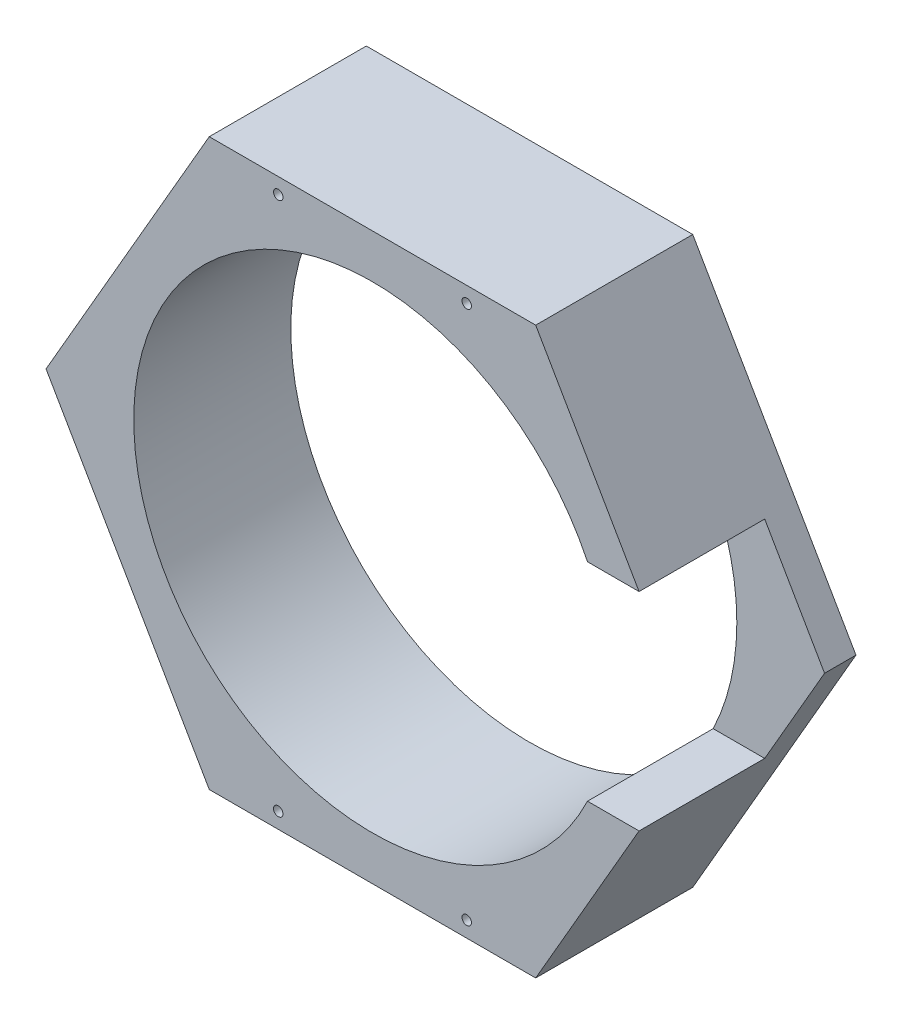
ISO-10303-21;
HEADER;
FILE_DESCRIPTION(('STEP AP214'),'2;1');
FILE_NAME('part.step','',(''),(''),'','','');
FILE_SCHEMA(('AUTOMOTIVE_DESIGN { 1 0 10303 214 1 1 1 1 }'));
ENDSEC;
DATA;
#1=APPLICATION_CONTEXT('core data for automotive mechanical design processes');
#2=APPLICATION_PROTOCOL_DEFINITION('international standard','automotive_design',2000,#1);
#3=PRODUCT_CONTEXT('',#1,'mechanical');
#4=PRODUCT('Part','Part','',(#3));
#5=PRODUCT_RELATED_PRODUCT_CATEGORY('part','',(#4));
#6=PRODUCT_DEFINITION_FORMATION('','',#4);
#7=PRODUCT_DEFINITION_CONTEXT('part definition',#1,'design');
#8=PRODUCT_DEFINITION('design','',#6,#7);
#9=PRODUCT_DEFINITION_SHAPE('','',#8);
#10=(LENGTH_UNIT() NAMED_UNIT(*) SI_UNIT(.MILLI.,.METRE.));
#11=(NAMED_UNIT(*) PLANE_ANGLE_UNIT() SI_UNIT($,.RADIAN.));
#12=(NAMED_UNIT(*) SI_UNIT($,.STERADIAN.) SOLID_ANGLE_UNIT());
#13=UNCERTAINTY_MEASURE_WITH_UNIT(LENGTH_MEASURE(1.E-05),#10,'distance_accuracy_value','');
#14=(GEOMETRIC_REPRESENTATION_CONTEXT(3) GLOBAL_UNCERTAINTY_ASSIGNED_CONTEXT((#13)) GLOBAL_UNIT_ASSIGNED_CONTEXT((#10,
#11,#12)) REPRESENTATION_CONTEXT('',''));
#15=CARTESIAN_POINT('',(0.,0.,0.));
#16=DIRECTION('',(0.,0.,1.));
#17=DIRECTION('',(1.,0.,0.));
#18=AXIS2_PLACEMENT_3D('',#15,#16,#17);
#19=CARTESIAN_POINT('',(0.,0.,50.));
#20=DIRECTION('',(0.,0.,1.));
#21=DIRECTION('',(1.,0.,0.));
#22=AXIS2_PLACEMENT_3D('',#19,#20,#21);
#23=PLANE('',#22);
#24=CARTESIAN_POINT('',(30.,85.,50.));
#25=DIRECTION('',(0.,0.,1.));
#26=DIRECTION('',(1.,0.,0.));
#27=AXIS2_PLACEMENT_3D('',#24,#25,#26);
#28=CIRCLE('',#27,1.5);
#29=CARTESIAN_POINT('',(31.5,85.,50.));
#30=VERTEX_POINT('',#29);
#31=EDGE_CURVE('E207',#30,#30,#28,.T.);
#32=ORIENTED_EDGE('',*,*,#31,.F.);
#33=EDGE_LOOP('',(#32));
#34=FACE_BOUND('',#33,.T.);
#35=CARTESIAN_POINT('',(30.,-85.,50.));
#36=DIRECTION('',(0.,0.,1.));
#37=DIRECTION('',(1.,0.,0.));
#38=AXIS2_PLACEMENT_3D('',#35,#36,#37);
#39=CIRCLE('',#38,1.5);
#40=CARTESIAN_POINT('',(31.5,-85.,50.));
#41=VERTEX_POINT('',#40);
#42=EDGE_CURVE('E191',#41,#41,#39,.T.);
#43=ORIENTED_EDGE('',*,*,#42,.F.);
#44=EDGE_LOOP('',(#43));
#45=FACE_BOUND('',#44,.T.);
#46=CARTESIAN_POINT('',(-30.,-85.,50.));
#47=DIRECTION('',(0.,0.,1.));
#48=DIRECTION('',(1.,0.,0.));
#49=AXIS2_PLACEMENT_3D('',#46,#47,#48);
#50=CIRCLE('',#49,1.5);
#51=CARTESIAN_POINT('',(-28.5,-85.,50.));
#52=VERTEX_POINT('',#51);
#53=EDGE_CURVE('E199',#52,#52,#50,.T.);
#54=ORIENTED_EDGE('',*,*,#53,.F.);
#55=EDGE_LOOP('',(#54));
#56=FACE_BOUND('',#55,.T.);
#57=CARTESIAN_POINT('',(-30.,85.,50.));
#58=DIRECTION('',(0.,0.,1.));
#59=DIRECTION('',(1.,0.,0.));
#60=AXIS2_PLACEMENT_3D('',#57,#58,#59);
#61=CIRCLE('',#60,1.5);
#62=CARTESIAN_POINT('',(-28.5,85.,50.));
#63=VERTEX_POINT('',#62);
#64=EDGE_CURVE('E215',#63,#63,#61,.T.);
#65=ORIENTED_EDGE('',*,*,#64,.F.);
#66=EDGE_LOOP('',(#65));
#67=FACE_BOUND('',#66,.T.);
#68=CARTESIAN_POINT('',(0.,0.,50.));
#69=DIRECTION('',(0.,0.,1.));
#70=DIRECTION('',(1.,0.,0.));
#71=AXIS2_PLACEMENT_3D('',#68,#69,#70);
#72=CIRCLE('',#71,76.);
#73=CARTESIAN_POINT('',(68.461668107051,33.,50.));
#74=VERTEX_POINT('',#73);
#75=CARTESIAN_POINT('',(68.461668107051,-33.,50.));
#76=VERTEX_POINT('',#75);
#77=EDGE_CURVE('E142',#74,#76,#72,.T.);
#78=ORIENTED_EDGE('',*,*,#77,.F.);
#79=DIRECTION('',(1.,0.,0.));
#80=VECTOR('',#79,1.);
#81=CARTESIAN_POINT('',(0.,33.,50.));
#82=LINE('',#81,#80);
#83=CARTESIAN_POINT('',(84.870489570875,33.,50.));
#84=VERTEX_POINT('',#83);
#85=EDGE_CURVE('E245',#74,#84,#82,.T.);
#86=ORIENTED_EDGE('',*,*,#85,.T.);
#87=DIRECTION('',(-0.500000000000001,0.866025403784438,0.));
#88=VECTOR('',#87,1.);
#89=CARTESIAN_POINT('',(103.923048454133,0.,50.));
#90=LINE('',#89,#88);
#91=CARTESIAN_POINT('',(51.9615242270661,90.0000000000002,50.));
#92=VERTEX_POINT('',#91);
#93=EDGE_CURVE('E97',#84,#92,#90,.T.);
#94=ORIENTED_EDGE('',*,*,#93,.T.);
#95=DIRECTION('',(-1.,0.,0.));
#96=VECTOR('',#95,1.);
#97=CARTESIAN_POINT('',(51.9615242270661,90.0000000000002,50.));
#98=LINE('',#97,#96);
#99=CARTESIAN_POINT('',(-51.9615242270668,89.9999999999998,50.));
#100=VERTEX_POINT('',#99);
#101=EDGE_CURVE('E112',#92,#100,#98,.T.);
#102=ORIENTED_EDGE('',*,*,#101,.T.);
#103=DIRECTION('',(-0.499999999999995,-0.866025403784441,0.));
#104=VECTOR('',#103,1.);
#105=CARTESIAN_POINT('',(-51.9615242270668,89.9999999999998,50.));
#106=LINE('',#105,#104);
#107=CARTESIAN_POINT('',(-103.923048454133,-7.2569076870659E-13,50.));
#108=VERTEX_POINT('',#107);
#109=EDGE_CURVE('E105',#100,#108,#106,.T.);
#110=ORIENTED_EDGE('',*,*,#109,.T.);
#111=DIRECTION('',(0.500000000000007,-0.866025403784435,0.));
#112=VECTOR('',#111,1.);
#113=CARTESIAN_POINT('',(-103.923048454133,-7.2569076870659E-13,50.));
#114=LINE('',#113,#112);
#115=CARTESIAN_POINT('',(-51.9615242270655,-90.0000000000005,50.));
#116=VERTEX_POINT('',#115);
#117=EDGE_CURVE('E109',#108,#116,#114,.T.);
#118=ORIENTED_EDGE('',*,*,#117,.T.);
#119=DIRECTION('',(1.,0.,0.));
#120=VECTOR('',#119,1.);
#121=CARTESIAN_POINT('',(-51.9615242270655,-90.0000000000005,50.));
#122=LINE('',#121,#120);
#123=CARTESIAN_POINT('',(51.9615242270674,-89.9999999999995,50.));
#124=VERTEX_POINT('',#123);
#125=EDGE_CURVE('E63',#116,#124,#122,.T.);
#126=ORIENTED_EDGE('',*,*,#125,.T.);
#127=DIRECTION('',(0.499999999999995,0.866025403784441,0.));
#128=VECTOR('',#127,1.);
#129=CARTESIAN_POINT('',(51.9615242270674,-89.9999999999995,50.));
#130=LINE('',#129,#128);
#131=CARTESIAN_POINT('',(84.8704895708753,-33.,50.));
#132=VERTEX_POINT('',#131);
#133=EDGE_CURVE('E155',#124,#132,#130,.T.);
#134=ORIENTED_EDGE('',*,*,#133,.T.);
#135=DIRECTION('',(1.,0.,0.));
#136=VECTOR('',#135,1.);
#137=CARTESIAN_POINT('',(0.,-33.,50.));
#138=LINE('',#137,#136);
#139=EDGE_CURVE('E241',#76,#132,#138,.T.);
#140=ORIENTED_EDGE('',*,*,#139,.F.);
#141=EDGE_LOOP('',(#78,#86,#94,#102,#110,#118,#126,#134,#140));
#142=FACE_BOUND('',#141,.T.);
#143=ADVANCED_FACE('F38',(#34,#45,#56,#67,#142),#23,.T.);
#144=CARTESIAN_POINT('',(103.923048454133,0.,50.));
#145=DIRECTION('',(-0.866025403784438,-0.500000000000001,0.));
#146=DIRECTION('',(0.500000000000001,-0.866025403784438,0.));
#147=AXIS2_PLACEMENT_3D('',#144,#145,#146);
#148=PLANE('',#147);
#149=DIRECTION('',(0.,0.,1.));
#150=VECTOR('',#149,1.);
#151=CARTESIAN_POINT('',(84.870489570875,33.,10.));
#152=LINE('',#151,#150);
#153=CARTESIAN_POINT('',(84.870489570875,33.,10.));
#154=VERTEX_POINT('',#153);
#155=EDGE_CURVE('E223',#154,#84,#152,.T.);
#156=ORIENTED_EDGE('',*,*,#155,.F.);
#157=DIRECTION('',(-0.500000000000001,0.866025403784438,0.));
#158=VECTOR('',#157,1.);
#159=CARTESIAN_POINT('',(77.9422863405994,45.0000000000001,10.));
#160=LINE('',#159,#158);
#161=CARTESIAN_POINT('',(103.923048454133,0.,10.));
#162=VERTEX_POINT('',#161);
#163=EDGE_CURVE('E232',#162,#154,#160,.T.);
#164=ORIENTED_EDGE('',*,*,#163,.F.);
#165=DIRECTION('',(0.,0.,-1.));
#166=VECTOR('',#165,1.);
#167=CARTESIAN_POINT('',(103.923048454133,0.,50.));
#168=LINE('',#167,#166);
#169=CARTESIAN_POINT('',(103.923048454133,0.,0.));
#170=VERTEX_POINT('',#169);
#171=EDGE_CURVE('E11',#162,#170,#168,.T.);
#172=ORIENTED_EDGE('',*,*,#171,.T.);
#173=DIRECTION('',(-0.500000000000001,0.866025403784438,0.));
#174=VECTOR('',#173,1.);
#175=CARTESIAN_POINT('',(103.923048454133,0.,0.));
#176=LINE('',#175,#174);
#177=CARTESIAN_POINT('',(51.9615242270661,90.0000000000002,0.));
#178=VERTEX_POINT('',#177);
#179=EDGE_CURVE('E141',#170,#178,#176,.T.);
#180=ORIENTED_EDGE('',*,*,#179,.T.);
#181=DIRECTION('',(0.,0.,-1.));
#182=VECTOR('',#181,1.);
#183=CARTESIAN_POINT('',(51.9615242270661,90.0000000000002,50.));
#184=LINE('',#183,#182);
#185=EDGE_CURVE('E47',#92,#178,#184,.T.);
#186=ORIENTED_EDGE('',*,*,#185,.F.);
#187=ORIENTED_EDGE('',*,*,#93,.F.);
#188=EDGE_LOOP('',(#156,#164,#172,#180,#186,#187));
#189=FACE_BOUND('',#188,.T.);
#190=ADVANCED_FACE('F272',(#189),#148,.F.);
#191=CARTESIAN_POINT('',(0.,0.,50.));
#192=DIRECTION('',(0.,0.,-1.));
#193=DIRECTION('',(-1.,0.,0.));
#194=AXIS2_PLACEMENT_3D('',#191,#192,#193);
#195=CYLINDRICAL_SURFACE('',#194,76.);
#196=CARTESIAN_POINT('',(0.,0.,0.));
#197=DIRECTION('',(0.,0.,1.));
#198=DIRECTION('',(1.,0.,0.));
#199=AXIS2_PLACEMENT_3D('',#196,#197,#198);
#200=CIRCLE('',#199,76.);
#201=CARTESIAN_POINT('',(76.,0.,0.));
#202=VERTEX_POINT('',#201);
#203=EDGE_CURVE('E186',#202,#202,#200,.T.);
#204=ORIENTED_EDGE('',*,*,#203,.F.);
#205=EDGE_LOOP('',(#204));
#206=FACE_BOUND('',#205,.T.);
#207=CARTESIAN_POINT('',(0.,0.,10.));
#208=DIRECTION('',(0.,0.,1.));
#209=DIRECTION('',(1.,0.,0.));
#210=AXIS2_PLACEMENT_3D('',#207,#208,#209);
#211=CIRCLE('',#210,76.);
#212=CARTESIAN_POINT('',(68.461668107051,33.,10.));
#213=VERTEX_POINT('',#212);
#214=CARTESIAN_POINT('',(68.461668107051,-33.,10.));
#215=VERTEX_POINT('',#214);
#216=EDGE_CURVE('E258',#213,#215,#211,.F.);
#217=ORIENTED_EDGE('',*,*,#216,.F.);
#218=DIRECTION('',(0.,0.,1.));
#219=VECTOR('',#218,1.);
#220=CARTESIAN_POINT('',(68.461668107051,33.,10.));
#221=LINE('',#220,#219);
#222=EDGE_CURVE('E227',#213,#74,#221,.T.);
#223=ORIENTED_EDGE('',*,*,#222,.T.);
#224=ORIENTED_EDGE('',*,*,#77,.T.);
#225=DIRECTION('',(0.,0.,1.));
#226=VECTOR('',#225,1.);
#227=CARTESIAN_POINT('',(68.461668107051,-33.,10.));
#228=LINE('',#227,#226);
#229=EDGE_CURVE('E231',#215,#76,#228,.T.);
#230=ORIENTED_EDGE('',*,*,#229,.F.);
#231=EDGE_LOOP('',(#217,#223,#224,#230));
#232=FACE_BOUND('',#231,.T.);
#233=ADVANCED_FACE('F287',(#206,#232),#195,.F.);
#234=CARTESIAN_POINT('',(0.,0.,0.));
#235=DIRECTION('',(0.,0.,1.));
#236=DIRECTION('',(1.,0.,0.));
#237=AXIS2_PLACEMENT_3D('',#234,#235,#236);
#238=PLANE('',#237);
#239=DIRECTION('',(0.499999999999995,0.866025403784441,0.));
#240=VECTOR('',#239,1.);
#241=CARTESIAN_POINT('',(51.9615242270674,-89.9999999999995,0.));
#242=LINE('',#241,#240);
#243=CARTESIAN_POINT('',(51.9615242270674,-89.9999999999995,0.));
#244=VERTEX_POINT('',#243);
#245=EDGE_CURVE('E137',#244,#170,#242,.T.);
#246=ORIENTED_EDGE('',*,*,#245,.F.);
#247=DIRECTION('',(1.,0.,0.));
#248=VECTOR('',#247,1.);
#249=CARTESIAN_POINT('',(-51.9615242270655,-90.0000000000005,0.));
#250=LINE('',#249,#248);
#251=CARTESIAN_POINT('',(-51.9615242270655,-90.0000000000005,0.));
#252=VERTEX_POINT('',#251);
#253=EDGE_CURVE('E89',#252,#244,#250,.T.);
#254=ORIENTED_EDGE('',*,*,#253,.F.);
#255=DIRECTION('',(0.500000000000007,-0.866025403784435,0.));
#256=VECTOR('',#255,1.);
#257=CARTESIAN_POINT('',(-103.923048454133,-7.2569076870659E-13,0.));
#258=LINE('',#257,#256);
#259=CARTESIAN_POINT('',(-103.923048454133,-7.2569076870659E-13,0.));
#260=VERTEX_POINT('',#259);
#261=EDGE_CURVE('E150',#260,#252,#258,.T.);
#262=ORIENTED_EDGE('',*,*,#261,.F.);
#263=DIRECTION('',(-0.499999999999995,-0.866025403784441,0.));
#264=VECTOR('',#263,1.);
#265=CARTESIAN_POINT('',(-51.9615242270668,89.9999999999998,0.));
#266=LINE('',#265,#264);
#267=CARTESIAN_POINT('',(-51.9615242270668,89.9999999999998,0.));
#268=VERTEX_POINT('',#267);
#269=EDGE_CURVE('E122',#268,#260,#266,.T.);
#270=ORIENTED_EDGE('',*,*,#269,.F.);
#271=DIRECTION('',(-1.,0.,0.));
#272=VECTOR('',#271,1.);
#273=CARTESIAN_POINT('',(51.9615242270661,90.0000000000002,0.));
#274=LINE('',#273,#272);
#275=EDGE_CURVE('E145',#178,#268,#274,.T.);
#276=ORIENTED_EDGE('',*,*,#275,.F.);
#277=ORIENTED_EDGE('',*,*,#179,.F.);
#278=EDGE_LOOP('',(#246,#254,#262,#270,#276,#277));
#279=FACE_BOUND('',#278,.T.);
#280=ORIENTED_EDGE('',*,*,#203,.T.);
#281=EDGE_LOOP('',(#280));
#282=FACE_BOUND('',#281,.T.);
#283=CARTESIAN_POINT('',(30.,-85.,0.));
#284=DIRECTION('',(0.,0.,1.));
#285=DIRECTION('',(1.,0.,0.));
#286=AXIS2_PLACEMENT_3D('',#283,#284,#285);
#287=CIRCLE('',#286,1.5);
#288=CARTESIAN_POINT('',(31.5,-85.,0.));
#289=VERTEX_POINT('',#288);
#290=EDGE_CURVE('E195',#289,#289,#287,.T.);
#291=ORIENTED_EDGE('',*,*,#290,.T.);
#292=EDGE_LOOP('',(#291));
#293=FACE_BOUND('',#292,.T.);
#294=CARTESIAN_POINT('',(-30.,-85.,0.));
#295=DIRECTION('',(0.,0.,1.));
#296=DIRECTION('',(1.,0.,0.));
#297=AXIS2_PLACEMENT_3D('',#294,#295,#296);
#298=CIRCLE('',#297,1.5);
#299=CARTESIAN_POINT('',(-28.5,-85.,0.));
#300=VERTEX_POINT('',#299);
#301=EDGE_CURVE('E203',#300,#300,#298,.T.);
#302=ORIENTED_EDGE('',*,*,#301,.T.);
#303=EDGE_LOOP('',(#302));
#304=FACE_BOUND('',#303,.T.);
#305=CARTESIAN_POINT('',(30.,85.,0.));
#306=DIRECTION('',(0.,0.,1.));
#307=DIRECTION('',(1.,0.,0.));
#308=AXIS2_PLACEMENT_3D('',#305,#306,#307);
#309=CIRCLE('',#308,1.5);
#310=CARTESIAN_POINT('',(31.5,85.,0.));
#311=VERTEX_POINT('',#310);
#312=EDGE_CURVE('E211',#311,#311,#309,.T.);
#313=ORIENTED_EDGE('',*,*,#312,.T.);
#314=EDGE_LOOP('',(#313));
#315=FACE_BOUND('',#314,.T.);
#316=CARTESIAN_POINT('',(-30.,85.,0.));
#317=DIRECTION('',(0.,0.,1.));
#318=DIRECTION('',(1.,0.,0.));
#319=AXIS2_PLACEMENT_3D('',#316,#317,#318);
#320=CIRCLE('',#319,1.5);
#321=CARTESIAN_POINT('',(-28.5,85.,0.));
#322=VERTEX_POINT('',#321);
#323=EDGE_CURVE('E219',#322,#322,#320,.T.);
#324=ORIENTED_EDGE('',*,*,#323,.T.);
#325=EDGE_LOOP('',(#324));
#326=FACE_BOUND('',#325,.T.);
#327=ADVANCED_FACE('F170',(#279,#282,#293,#304,#315,#326),#238,.F.);
#328=CARTESIAN_POINT('',(51.9615242270674,-89.9999999999995,50.));
#329=DIRECTION('',(-0.866025403784442,0.499999999999995,0.));
#330=DIRECTION('',(-0.499999999999995,-0.866025403784442,0.));
#331=AXIS2_PLACEMENT_3D('',#328,#329,#330);
#332=PLANE('',#331);
#333=DIRECTION('',(0.499999999999995,0.866025403784442,0.));
#334=VECTOR('',#333,1.);
#335=CARTESIAN_POINT('',(77.9422863406,-44.9999999999997,10.));
#336=LINE('',#335,#334);
#337=CARTESIAN_POINT('',(84.8704895708753,-33.,10.));
#338=VERTEX_POINT('',#337);
#339=EDGE_CURVE('E250',#338,#162,#336,.T.);
#340=ORIENTED_EDGE('',*,*,#339,.F.);
#341=DIRECTION('',(0.,0.,1.));
#342=VECTOR('',#341,1.);
#343=CARTESIAN_POINT('',(84.8704895708753,-33.,10.));
#344=LINE('',#343,#342);
#345=EDGE_CURVE('E179',#338,#132,#344,.T.);
#346=ORIENTED_EDGE('',*,*,#345,.T.);
#347=ORIENTED_EDGE('',*,*,#133,.F.);
#348=DIRECTION('',(0.,0.,-1.));
#349=VECTOR('',#348,1.);
#350=CARTESIAN_POINT('',(51.9615242270674,-89.9999999999995,50.));
#351=LINE('',#350,#349);
#352=EDGE_CURVE('E133',#124,#244,#351,.T.);
#353=ORIENTED_EDGE('',*,*,#352,.T.);
#354=ORIENTED_EDGE('',*,*,#245,.T.);
#355=ORIENTED_EDGE('',*,*,#171,.F.);
#356=EDGE_LOOP('',(#340,#346,#347,#353,#354,#355));
#357=FACE_BOUND('',#356,.T.);
#358=ADVANCED_FACE('F40',(#357),#332,.F.);
#359=CARTESIAN_POINT('',(51.9615242270661,90.0000000000002,50.));
#360=DIRECTION('',(0.,-1.,0.));
#361=DIRECTION('',(1.,0.,0.));
#362=AXIS2_PLACEMENT_3D('',#359,#360,#361);
#363=PLANE('',#362);
#364=ORIENTED_EDGE('',*,*,#275,.T.);
#365=DIRECTION('',(0.,0.,-1.));
#366=VECTOR('',#365,1.);
#367=CARTESIAN_POINT('',(-51.9615242270668,89.9999999999998,50.));
#368=LINE('',#367,#366);
#369=EDGE_CURVE('E126',#100,#268,#368,.T.);
#370=ORIENTED_EDGE('',*,*,#369,.F.);
#371=ORIENTED_EDGE('',*,*,#101,.F.);
#372=ORIENTED_EDGE('',*,*,#185,.T.);
#373=EDGE_LOOP('',(#364,#370,#371,#372));
#374=FACE_BOUND('',#373,.T.);
#375=ADVANCED_FACE('F165',(#374),#363,.F.);
#376=CARTESIAN_POINT('',(-51.9615242270668,89.9999999999998,50.));
#377=DIRECTION('',(0.866025403784442,-0.499999999999995,0.));
#378=DIRECTION('',(0.499999999999995,0.866025403784442,0.));
#379=AXIS2_PLACEMENT_3D('',#376,#377,#378);
#380=PLANE('',#379);
#381=ORIENTED_EDGE('',*,*,#269,.T.);
#382=DIRECTION('',(0.,0.,-1.));
#383=VECTOR('',#382,1.);
#384=CARTESIAN_POINT('',(-103.923048454133,-7.2569076870659E-13,50.));
#385=LINE('',#384,#383);
#386=EDGE_CURVE('E119',#108,#260,#385,.T.);
#387=ORIENTED_EDGE('',*,*,#386,.F.);
#388=ORIENTED_EDGE('',*,*,#109,.F.);
#389=ORIENTED_EDGE('',*,*,#369,.T.);
#390=EDGE_LOOP('',(#381,#387,#388,#389));
#391=FACE_BOUND('',#390,.T.);
#392=ADVANCED_FACE('F120',(#391),#380,.F.);
#393=CARTESIAN_POINT('',(-103.923048454133,-7.2569076870659E-13,50.));
#394=DIRECTION('',(0.866025403784435,0.500000000000007,0.));
#395=DIRECTION('',(-0.500000000000007,0.866025403784435,0.));
#396=AXIS2_PLACEMENT_3D('',#393,#394,#395);
#397=PLANE('',#396);
#398=ORIENTED_EDGE('',*,*,#261,.T.);
#399=DIRECTION('',(0.,0.,-1.));
#400=VECTOR('',#399,1.);
#401=CARTESIAN_POINT('',(-51.9615242270655,-90.0000000000005,50.));
#402=LINE('',#401,#400);
#403=EDGE_CURVE('E127',#116,#252,#402,.T.);
#404=ORIENTED_EDGE('',*,*,#403,.F.);
#405=ORIENTED_EDGE('',*,*,#117,.F.);
#406=ORIENTED_EDGE('',*,*,#386,.T.);
#407=EDGE_LOOP('',(#398,#404,#405,#406));
#408=FACE_BOUND('',#407,.T.);
#409=ADVANCED_FACE('F129',(#408),#397,.F.);
#410=CARTESIAN_POINT('',(-51.9615242270655,-90.0000000000005,50.));
#411=DIRECTION('',(0.,1.,0.));
#412=DIRECTION('',(-1.,0.,0.));
#413=AXIS2_PLACEMENT_3D('',#410,#411,#412);
#414=PLANE('',#413);
#415=ORIENTED_EDGE('',*,*,#253,.T.);
#416=ORIENTED_EDGE('',*,*,#352,.F.);
#417=ORIENTED_EDGE('',*,*,#125,.F.);
#418=ORIENTED_EDGE('',*,*,#403,.T.);
#419=EDGE_LOOP('',(#415,#416,#417,#418));
#420=FACE_BOUND('',#419,.T.);
#421=ADVANCED_FACE('F172',(#420),#414,.F.);
#422=CARTESIAN_POINT('',(30.,-85.,50.));
#423=DIRECTION('',(0.,0.,-1.));
#424=DIRECTION('',(-1.,0.,0.));
#425=AXIS2_PLACEMENT_3D('',#422,#423,#424);
#426=CYLINDRICAL_SURFACE('',#425,1.5);
#427=ORIENTED_EDGE('',*,*,#42,.T.);
#428=EDGE_LOOP('',(#427));
#429=FACE_BOUND('',#428,.T.);
#430=ORIENTED_EDGE('',*,*,#290,.F.);
#431=EDGE_LOOP('',(#430));
#432=FACE_BOUND('',#431,.T.);
#433=ADVANCED_FACE('F310',(#429,#432),#426,.F.);
#434=CARTESIAN_POINT('',(-30.,-85.,50.));
#435=DIRECTION('',(0.,0.,-1.));
#436=DIRECTION('',(-1.,0.,0.));
#437=AXIS2_PLACEMENT_3D('',#434,#435,#436);
#438=CYLINDRICAL_SURFACE('',#437,1.5);
#439=ORIENTED_EDGE('',*,*,#53,.T.);
#440=EDGE_LOOP('',(#439));
#441=FACE_BOUND('',#440,.T.);
#442=ORIENTED_EDGE('',*,*,#301,.F.);
#443=EDGE_LOOP('',(#442));
#444=FACE_BOUND('',#443,.T.);
#445=ADVANCED_FACE('F358',(#441,#444),#438,.F.);
#446=CARTESIAN_POINT('',(30.,85.,50.));
#447=DIRECTION('',(0.,0.,-1.));
#448=DIRECTION('',(-1.,0.,0.));
#449=AXIS2_PLACEMENT_3D('',#446,#447,#448);
#450=CYLINDRICAL_SURFACE('',#449,1.5);
#451=ORIENTED_EDGE('',*,*,#31,.T.);
#452=EDGE_LOOP('',(#451));
#453=FACE_BOUND('',#452,.T.);
#454=ORIENTED_EDGE('',*,*,#312,.F.);
#455=EDGE_LOOP('',(#454));
#456=FACE_BOUND('',#455,.T.);
#457=ADVANCED_FACE('F354',(#453,#456),#450,.F.);
#458=CARTESIAN_POINT('',(-30.,85.,50.));
#459=DIRECTION('',(0.,0.,-1.));
#460=DIRECTION('',(-1.,0.,0.));
#461=AXIS2_PLACEMENT_3D('',#458,#459,#460);
#462=CYLINDRICAL_SURFACE('',#461,1.5);
#463=ORIENTED_EDGE('',*,*,#64,.T.);
#464=EDGE_LOOP('',(#463));
#465=FACE_BOUND('',#464,.T.);
#466=ORIENTED_EDGE('',*,*,#323,.F.);
#467=EDGE_LOOP('',(#466));
#468=FACE_BOUND('',#467,.T.);
#469=ADVANCED_FACE('F327',(#465,#468),#462,.F.);
#470=CARTESIAN_POINT('',(0.,33.,10.));
#471=DIRECTION('',(0.,-1.,0.));
#472=DIRECTION('',(0.,0.,-1.));
#473=AXIS2_PLACEMENT_3D('',#470,#471,#472);
#474=PLANE('',#473);
#475=ORIENTED_EDGE('',*,*,#85,.F.);
#476=ORIENTED_EDGE('',*,*,#222,.F.);
#477=DIRECTION('',(1.,0.,0.));
#478=VECTOR('',#477,1.);
#479=CARTESIAN_POINT('',(0.,33.,10.));
#480=LINE('',#479,#478);
#481=EDGE_CURVE('E54',#213,#154,#480,.T.);
#482=ORIENTED_EDGE('',*,*,#481,.T.);
#483=ORIENTED_EDGE('',*,*,#155,.T.);
#484=EDGE_LOOP('',(#475,#476,#482,#483));
#485=FACE_BOUND('',#484,.T.);
#486=ADVANCED_FACE('F264',(#485),#474,.T.);
#487=CARTESIAN_POINT('',(0.,-33.,10.));
#488=DIRECTION('',(0.,-1.,0.));
#489=DIRECTION('',(0.,0.,-1.));
#490=AXIS2_PLACEMENT_3D('',#487,#488,#489);
#491=PLANE('',#490);
#492=ORIENTED_EDGE('',*,*,#139,.T.);
#493=ORIENTED_EDGE('',*,*,#345,.F.);
#494=DIRECTION('',(1.,0.,0.));
#495=VECTOR('',#494,1.);
#496=CARTESIAN_POINT('',(0.,-33.,10.));
#497=LINE('',#496,#495);
#498=EDGE_CURVE('E254',#215,#338,#497,.T.);
#499=ORIENTED_EDGE('',*,*,#498,.F.);
#500=ORIENTED_EDGE('',*,*,#229,.T.);
#501=EDGE_LOOP('',(#492,#493,#499,#500));
#502=FACE_BOUND('',#501,.T.);
#503=ADVANCED_FACE('F284',(#502),#491,.F.);
#504=CARTESIAN_POINT('',(0.,0.,10.));
#505=DIRECTION('',(0.,0.,1.));
#506=DIRECTION('',(1.,0.,0.));
#507=AXIS2_PLACEMENT_3D('',#504,#505,#506);
#508=PLANE('',#507);
#509=ORIENTED_EDGE('',*,*,#481,.F.);
#510=ORIENTED_EDGE('',*,*,#216,.T.);
#511=ORIENTED_EDGE('',*,*,#498,.T.);
#512=ORIENTED_EDGE('',*,*,#339,.T.);
#513=ORIENTED_EDGE('',*,*,#163,.T.);
#514=EDGE_LOOP('',(#509,#510,#511,#512,#513));
#515=FACE_BOUND('',#514,.T.);
#516=ADVANCED_FACE('F270',(#515),#508,.T.);
#517=CLOSED_SHELL('',(#143,#190,#233,#327,#358,#375,#392,#409,#421,#433,#445,#457,#469,#486,
#503,#516));
#518=MANIFOLD_SOLID_BREP('B2',#517);
#519=ADVANCED_BREP_SHAPE_REPRESENTATION('',(#18,#518),#14);
#520=SHAPE_DEFINITION_REPRESENTATION(#9,#519);
ENDSEC;
END-ISO-10303-21;
